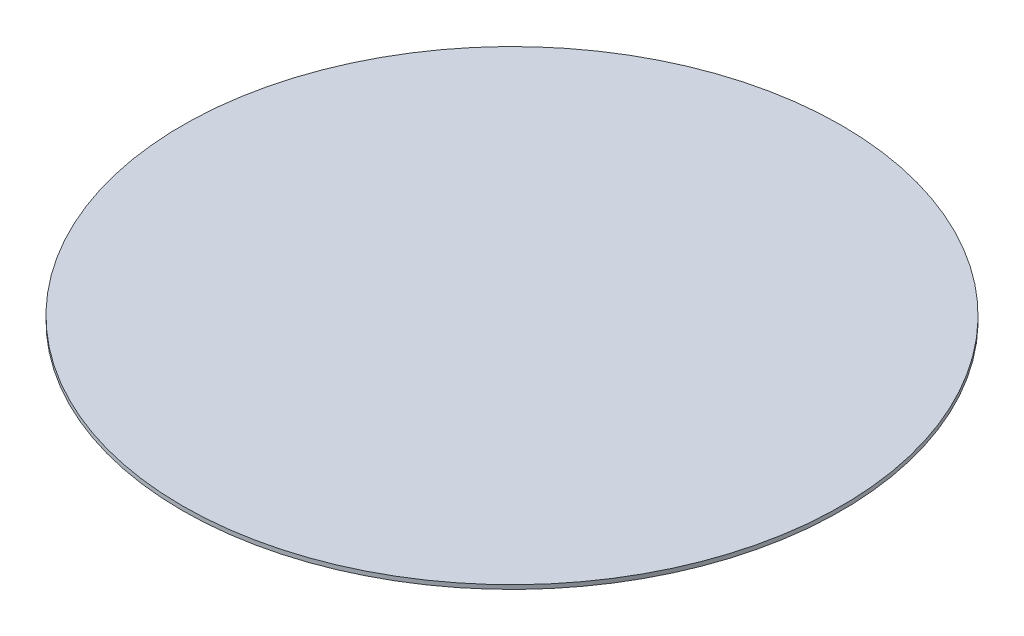
ISO-10303-21;
HEADER;
FILE_DESCRIPTION(('STEP AP214'),'2;1');
FILE_NAME('part.step','',(''),(''),'','','');
FILE_SCHEMA(('AUTOMOTIVE_DESIGN { 1 0 10303 214 1 1 1 1 }'));
ENDSEC;
DATA;
#1=APPLICATION_CONTEXT('core data for automotive mechanical design processes');
#2=APPLICATION_PROTOCOL_DEFINITION('international standard','automotive_design',2000,#1);
#3=PRODUCT_CONTEXT('',#1,'mechanical');
#4=PRODUCT('Part','Part','',(#3));
#5=PRODUCT_RELATED_PRODUCT_CATEGORY('part','',(#4));
#6=PRODUCT_DEFINITION_FORMATION('','',#4);
#7=PRODUCT_DEFINITION_CONTEXT('part definition',#1,'design');
#8=PRODUCT_DEFINITION('design','',#6,#7);
#9=PRODUCT_DEFINITION_SHAPE('','',#8);
#10=(LENGTH_UNIT() NAMED_UNIT(*) SI_UNIT(.MILLI.,.METRE.));
#11=(NAMED_UNIT(*) PLANE_ANGLE_UNIT() SI_UNIT($,.RADIAN.));
#12=(NAMED_UNIT(*) SI_UNIT($,.STERADIAN.) SOLID_ANGLE_UNIT());
#13=UNCERTAINTY_MEASURE_WITH_UNIT(LENGTH_MEASURE(1.E-05),#10,'distance_accuracy_value','');
#14=(GEOMETRIC_REPRESENTATION_CONTEXT(3) GLOBAL_UNCERTAINTY_ASSIGNED_CONTEXT((#13)) GLOBAL_UNIT_ASSIGNED_CONTEXT((#10,
#11,#12)) REPRESENTATION_CONTEXT('',''));
#15=CARTESIAN_POINT('',(0.,0.,0.));
#16=DIRECTION('',(0.,0.,1.));
#17=DIRECTION('',(1.,0.,0.));
#18=AXIS2_PLACEMENT_3D('',#15,#16,#17);
#19=CARTESIAN_POINT('',(0.,1.,0.));
#20=DIRECTION('',(0.,-1.,0.));
#21=DIRECTION('',(0.,0.,-1.));
#22=AXIS2_PLACEMENT_3D('',#19,#20,#21);
#23=CYLINDRICAL_SURFACE('',#22,80.);
#24=CARTESIAN_POINT('',(0.,1.,0.));
#25=DIRECTION('',(0.,1.,0.));
#26=DIRECTION('',(0.,0.,1.));
#27=AXIS2_PLACEMENT_3D('',#24,#25,#26);
#28=CIRCLE('',#27,80.);
#29=CARTESIAN_POINT('',(0.,1.,80.));
#30=VERTEX_POINT('',#29);
#31=EDGE_CURVE('E10',#30,#30,#28,.T.);
#32=ORIENTED_EDGE('',*,*,#31,.F.);
#33=EDGE_LOOP('',(#32));
#34=FACE_BOUND('',#33,.T.);
#35=CARTESIAN_POINT('',(0.,0.,0.));
#36=DIRECTION('',(0.,1.,0.));
#37=DIRECTION('',(0.,0.,1.));
#38=AXIS2_PLACEMENT_3D('',#35,#36,#37);
#39=CIRCLE('',#38,80.);
#40=CARTESIAN_POINT('',(0.,0.,80.));
#41=VERTEX_POINT('',#40);
#42=EDGE_CURVE('E34',#41,#41,#39,.T.);
#43=ORIENTED_EDGE('',*,*,#42,.T.);
#44=EDGE_LOOP('',(#43));
#45=FACE_BOUND('',#44,.T.);
#46=ADVANCED_FACE('F31',(#34,#45),#23,.T.);
#47=CARTESIAN_POINT('',(0.,1.,0.));
#48=DIRECTION('',(0.,1.,0.));
#49=DIRECTION('',(0.,0.,1.));
#50=AXIS2_PLACEMENT_3D('',#47,#48,#49);
#51=PLANE('',#50);
#52=ORIENTED_EDGE('',*,*,#31,.T.);
#53=EDGE_LOOP('',(#52));
#54=FACE_BOUND('',#53,.T.);
#55=ADVANCED_FACE('F46',(#54),#51,.T.);
#56=CARTESIAN_POINT('',(0.,0.,0.));
#57=DIRECTION('',(0.,1.,0.));
#58=DIRECTION('',(0.,0.,1.));
#59=AXIS2_PLACEMENT_3D('',#56,#57,#58);
#60=PLANE('',#59);
#61=ORIENTED_EDGE('',*,*,#42,.F.);
#62=EDGE_LOOP('',(#61));
#63=FACE_BOUND('',#62,.T.);
#64=ADVANCED_FACE('F44',(#63),#60,.F.);
#65=CLOSED_SHELL('',(#46,#55,#64));
#66=MANIFOLD_SOLID_BREP('B2',#65);
#67=ADVANCED_BREP_SHAPE_REPRESENTATION('',(#18,#66),#14);
#68=SHAPE_DEFINITION_REPRESENTATION(#9,#67);
ENDSEC;
END-ISO-10303-21;
